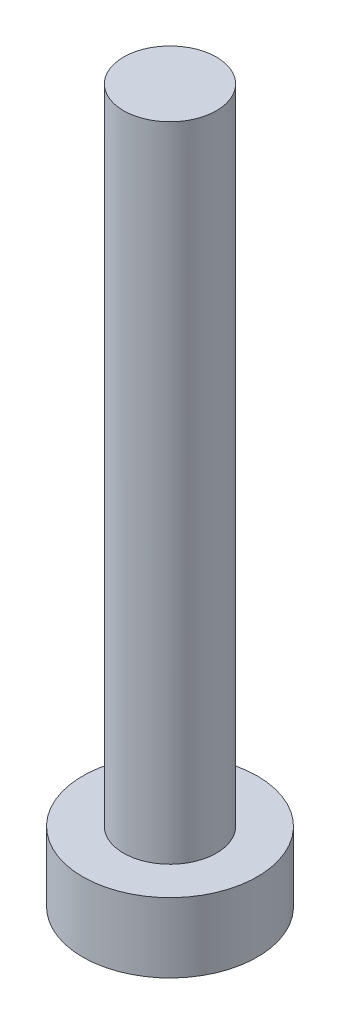
ISO-10303-21;
HEADER;
FILE_DESCRIPTION(('STEP AP214'),'2;1');
FILE_NAME('part.step','',(''),(''),'','','');
FILE_SCHEMA(('AUTOMOTIVE_DESIGN { 1 0 10303 214 1 1 1 1 }'));
ENDSEC;
DATA;
#1=APPLICATION_CONTEXT('core data for automotive mechanical design processes');
#2=APPLICATION_PROTOCOL_DEFINITION('international standard','automotive_design',2000,#1);
#3=PRODUCT_CONTEXT('',#1,'mechanical');
#4=PRODUCT('Part','Part','',(#3));
#5=PRODUCT_RELATED_PRODUCT_CATEGORY('part','',(#4));
#6=PRODUCT_DEFINITION_FORMATION('','',#4);
#7=PRODUCT_DEFINITION_CONTEXT('part definition',#1,'design');
#8=PRODUCT_DEFINITION('design','',#6,#7);
#9=PRODUCT_DEFINITION_SHAPE('','',#8);
#10=(LENGTH_UNIT() NAMED_UNIT(*) SI_UNIT(.MILLI.,.METRE.));
#11=(NAMED_UNIT(*) PLANE_ANGLE_UNIT() SI_UNIT($,.RADIAN.));
#12=(NAMED_UNIT(*) SI_UNIT($,.STERADIAN.) SOLID_ANGLE_UNIT());
#13=UNCERTAINTY_MEASURE_WITH_UNIT(LENGTH_MEASURE(1.E-05),#10,'distance_accuracy_value','');
#14=(GEOMETRIC_REPRESENTATION_CONTEXT(3) GLOBAL_UNCERTAINTY_ASSIGNED_CONTEXT((#13)) GLOBAL_UNIT_ASSIGNED_CONTEXT((#10,
#11,#12)) REPRESENTATION_CONTEXT('',''));
#15=CARTESIAN_POINT('',(0.,0.,0.));
#16=DIRECTION('',(0.,0.,1.));
#17=DIRECTION('',(1.,0.,0.));
#18=AXIS2_PLACEMENT_3D('',#15,#16,#17);
#19=CARTESIAN_POINT('',(0.,18.48,0.));
#20=DIRECTION('',(0.,-1.,0.));
#21=DIRECTION('',(0.,0.,-1.));
#22=AXIS2_PLACEMENT_3D('',#19,#20,#21);
#23=CYLINDRICAL_SURFACE('',#22,1.335);
#24=CARTESIAN_POINT('',(0.,18.48,0.));
#25=DIRECTION('',(0.,1.,0.));
#26=DIRECTION('',(0.,0.,1.));
#27=AXIS2_PLACEMENT_3D('',#24,#25,#26);
#28=CIRCLE('',#27,1.335);
#29=CARTESIAN_POINT('',(0.,18.48,1.335));
#30=VERTEX_POINT('',#29);
#31=EDGE_CURVE('E12',#30,#30,#28,.T.);
#32=ORIENTED_EDGE('',*,*,#31,.F.);
#33=EDGE_LOOP('',(#32));
#34=FACE_BOUND('',#33,.T.);
#35=CARTESIAN_POINT('',(0.,0.,0.));
#36=DIRECTION('',(0.,-1.,0.));
#37=DIRECTION('',(0.,0.,-1.));
#38=AXIS2_PLACEMENT_3D('',#35,#36,#37);
#39=CIRCLE('',#38,1.335);
#40=CARTESIAN_POINT('',(0.,0.,-1.335));
#41=VERTEX_POINT('',#40);
#42=EDGE_CURVE('E48',#41,#41,#39,.T.);
#43=ORIENTED_EDGE('',*,*,#42,.F.);
#44=EDGE_LOOP('',(#43));
#45=FACE_BOUND('',#44,.T.);
#46=ADVANCED_FACE('F42',(#34,#45),#23,.T.);
#47=CARTESIAN_POINT('',(0.,18.48,0.));
#48=DIRECTION('',(0.,1.,0.));
#49=DIRECTION('',(0.,0.,1.));
#50=AXIS2_PLACEMENT_3D('',#47,#48,#49);
#51=PLANE('',#50);
#52=ORIENTED_EDGE('',*,*,#31,.T.);
#53=EDGE_LOOP('',(#52));
#54=FACE_BOUND('',#53,.T.);
#55=ADVANCED_FACE('F75',(#54),#51,.T.);
#56=CARTESIAN_POINT('',(0.,-2.,0.));
#57=DIRECTION('',(0.,1.,0.));
#58=DIRECTION('',(0.,0.,1.));
#59=AXIS2_PLACEMENT_3D('',#56,#57,#58);
#60=CYLINDRICAL_SURFACE('',#59,2.51);
#61=CARTESIAN_POINT('',(0.,-2.,0.));
#62=DIRECTION('',(0.,-1.,0.));
#63=DIRECTION('',(0.,0.,-1.));
#64=AXIS2_PLACEMENT_3D('',#61,#62,#63);
#65=CIRCLE('',#64,2.51);
#66=CARTESIAN_POINT('',(0.,-2.,-2.51));
#67=VERTEX_POINT('',#66);
#68=EDGE_CURVE('E52',#67,#67,#65,.T.);
#69=ORIENTED_EDGE('',*,*,#68,.F.);
#70=EDGE_LOOP('',(#69));
#71=FACE_BOUND('',#70,.T.);
#72=CARTESIAN_POINT('',(0.,0.,0.));
#73=DIRECTION('',(0.,-1.,0.));
#74=DIRECTION('',(0.,0.,-1.));
#75=AXIS2_PLACEMENT_3D('',#72,#73,#74);
#76=CIRCLE('',#75,2.51);
#77=CARTESIAN_POINT('',(0.,0.,-2.51));
#78=VERTEX_POINT('',#77);
#79=EDGE_CURVE('E56',#78,#78,#76,.T.);
#80=ORIENTED_EDGE('',*,*,#79,.T.);
#81=EDGE_LOOP('',(#80));
#82=FACE_BOUND('',#81,.T.);
#83=ADVANCED_FACE('F62',(#71,#82),#60,.T.);
#84=CARTESIAN_POINT('',(0.,-2.,0.));
#85=DIRECTION('',(0.,-1.,0.));
#86=DIRECTION('',(0.,0.,-1.));
#87=AXIS2_PLACEMENT_3D('',#84,#85,#86);
#88=PLANE('',#87);
#89=ORIENTED_EDGE('',*,*,#68,.T.);
#90=EDGE_LOOP('',(#89));
#91=FACE_BOUND('',#90,.T.);
#92=ADVANCED_FACE('F66',(#91),#88,.T.);
#93=CARTESIAN_POINT('',(0.,0.,0.));
#94=DIRECTION('',(0.,-1.,0.));
#95=DIRECTION('',(0.,0.,-1.));
#96=AXIS2_PLACEMENT_3D('',#93,#94,#95);
#97=PLANE('',#96);
#98=ORIENTED_EDGE('',*,*,#42,.T.);
#99=EDGE_LOOP('',(#98));
#100=FACE_BOUND('',#99,.T.);
#101=ORIENTED_EDGE('',*,*,#79,.F.);
#102=EDGE_LOOP('',(#101));
#103=FACE_BOUND('',#102,.T.);
#104=ADVANCED_FACE('F64',(#100,#103),#97,.F.);
#105=CLOSED_SHELL('',(#46,#55,#83,#92,#104));
#106=MANIFOLD_SOLID_BREP('B2',#105);
#107=ADVANCED_BREP_SHAPE_REPRESENTATION('',(#18,#106),#14);
#108=SHAPE_DEFINITION_REPRESENTATION(#9,#107);
ENDSEC;
END-ISO-10303-21;
